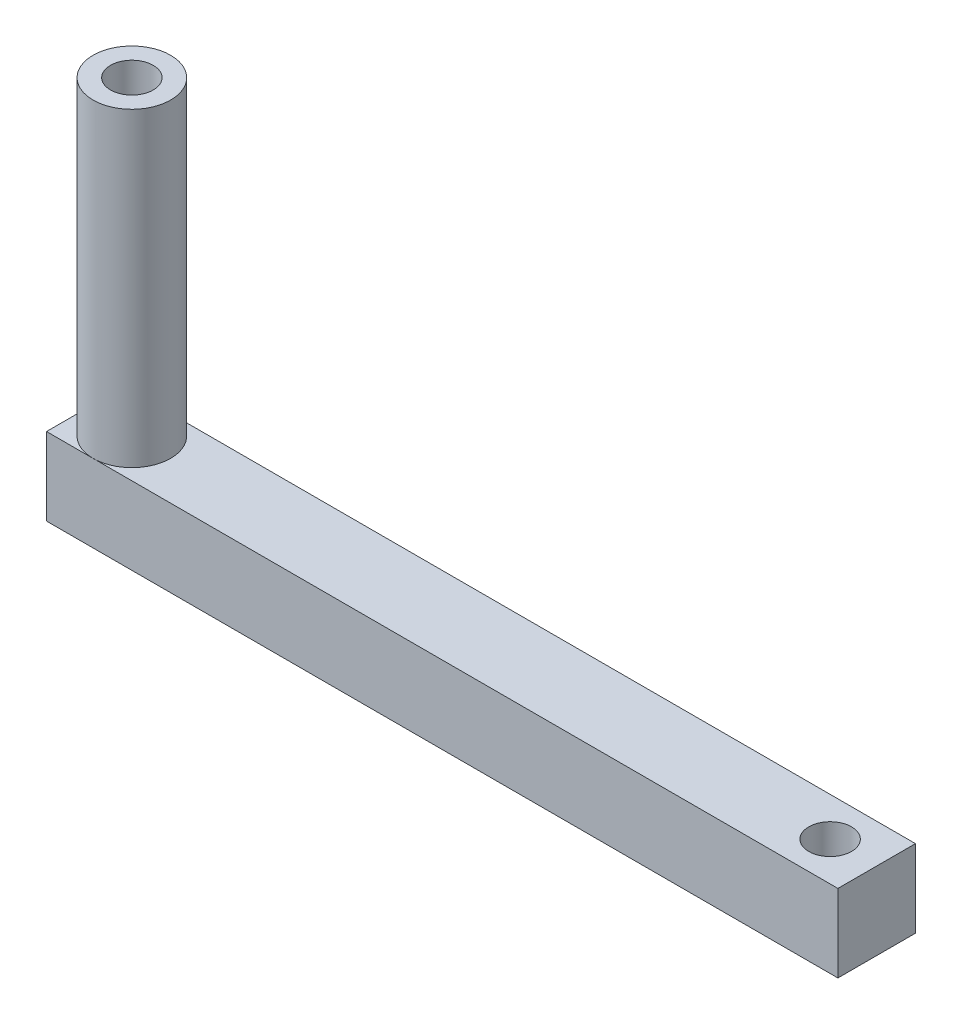
ISO-10303-21;
HEADER;
FILE_DESCRIPTION(('STEP AP214'),'2;1');
FILE_NAME('part.step','',(''),(''),'','','');
FILE_SCHEMA(('AUTOMOTIVE_DESIGN { 1 0 10303 214 1 1 1 1 }'));
ENDSEC;
DATA;
#1=APPLICATION_CONTEXT('core data for automotive mechanical design processes');
#2=APPLICATION_PROTOCOL_DEFINITION('international standard','automotive_design',2000,#1);
#3=PRODUCT_CONTEXT('',#1,'mechanical');
#4=PRODUCT('Part','Part','',(#3));
#5=PRODUCT_RELATED_PRODUCT_CATEGORY('part','',(#4));
#6=PRODUCT_DEFINITION_FORMATION('','',#4);
#7=PRODUCT_DEFINITION_CONTEXT('part definition',#1,'design');
#8=PRODUCT_DEFINITION('design','',#6,#7);
#9=PRODUCT_DEFINITION_SHAPE('','',#8);
#10=(LENGTH_UNIT() NAMED_UNIT(*) SI_UNIT(.MILLI.,.METRE.));
#11=(NAMED_UNIT(*) PLANE_ANGLE_UNIT() SI_UNIT($,.RADIAN.));
#12=(NAMED_UNIT(*) SI_UNIT($,.STERADIAN.) SOLID_ANGLE_UNIT());
#13=UNCERTAINTY_MEASURE_WITH_UNIT(LENGTH_MEASURE(1.E-05),#10,'distance_accuracy_value','');
#14=(GEOMETRIC_REPRESENTATION_CONTEXT(3) GLOBAL_UNCERTAINTY_ASSIGNED_CONTEXT((#13)) GLOBAL_UNIT_ASSIGNED_CONTEXT((#10,
#11,#12)) REPRESENTATION_CONTEXT('',''));
#15=CARTESIAN_POINT('',(0.,0.,0.));
#16=DIRECTION('',(0.,0.,1.));
#17=DIRECTION('',(1.,0.,0.));
#18=AXIS2_PLACEMENT_3D('',#15,#16,#17);
#19=CARTESIAN_POINT('',(0.,0.,0.));
#20=DIRECTION('',(0.,-1.,0.));
#21=DIRECTION('',(0.,0.,-1.));
#22=AXIS2_PLACEMENT_3D('',#19,#20,#21);
#23=PLANE('',#22);
#24=CARTESIAN_POINT('',(60.96,0.,-3.175));
#25=DIRECTION('',(0.,1.,0.));
#26=DIRECTION('',(0.,0.,1.));
#27=AXIS2_PLACEMENT_3D('',#24,#25,#26);
#28=CIRCLE('',#27,1.75);
#29=CARTESIAN_POINT('',(60.96,0.,-1.425));
#30=VERTEX_POINT('',#29);
#31=EDGE_CURVE('E157',#30,#30,#28,.T.);
#32=ORIENTED_EDGE('',*,*,#31,.F.);
#33=EDGE_LOOP('',(#32));
#34=FACE_BOUND('',#33,.T.);
#35=DIRECTION('',(-1.,0.,0.));
#36=VECTOR('',#35,1.);
#37=CARTESIAN_POINT('',(0.,0.,-6.35));
#38=LINE('',#37,#36);
#39=CARTESIAN_POINT('',(64.77,0.,-6.35));
#40=VERTEX_POINT('',#39);
#41=CARTESIAN_POINT('',(3.81,0.,-6.35));
#42=VERTEX_POINT('',#41);
#43=EDGE_CURVE('E109',#40,#42,#38,.T.);
#44=ORIENTED_EDGE('',*,*,#43,.T.);
#45=CARTESIAN_POINT('',(3.81,0.,-3.175));
#46=DIRECTION('',(0.,-1.,0.));
#47=DIRECTION('',(0.,0.,-1.));
#48=AXIS2_PLACEMENT_3D('',#45,#46,#47);
#49=CIRCLE('',#48,3.175);
#50=CARTESIAN_POINT('',(3.81,0.,0.));
#51=VERTEX_POINT('',#50);
#52=EDGE_CURVE('E57',#42,#51,#49,.T.);
#53=ORIENTED_EDGE('',*,*,#52,.T.);
#54=DIRECTION('',(1.,0.,0.));
#55=VECTOR('',#54,1.);
#56=CARTESIAN_POINT('',(0.,0.,0.));
#57=LINE('',#56,#55);
#58=CARTESIAN_POINT('',(64.77,0.,0.));
#59=VERTEX_POINT('',#58);
#60=EDGE_CURVE('E106',#51,#59,#57,.T.);
#61=ORIENTED_EDGE('',*,*,#60,.T.);
#62=DIRECTION('',(0.,0.,-1.));
#63=VECTOR('',#62,1.);
#64=CARTESIAN_POINT('',(64.77,0.,0.));
#65=LINE('',#64,#63);
#66=EDGE_CURVE('E122',#59,#40,#65,.T.);
#67=ORIENTED_EDGE('',*,*,#66,.T.);
#68=EDGE_LOOP('',(#44,#53,#61,#67));
#69=FACE_BOUND('',#68,.T.);
#70=ADVANCED_FACE('F45',(#34,#69),#23,.F.);
#71=CARTESIAN_POINT('',(0.,-6.35,0.));
#72=DIRECTION('',(-1.,0.,0.));
#73=DIRECTION('',(0.,0.,1.));
#74=AXIS2_PLACEMENT_3D('',#71,#72,#73);
#75=PLANE('',#74);
#76=DIRECTION('',(0.,0.,1.));
#77=VECTOR('',#76,1.);
#78=CARTESIAN_POINT('',(0.,0.,0.));
#79=LINE('',#78,#77);
#80=CARTESIAN_POINT('',(0.,0.,-6.35));
#81=VERTEX_POINT('',#80);
#82=CARTESIAN_POINT('',(0.,0.,0.));
#83=VERTEX_POINT('',#82);
#84=EDGE_CURVE('E118',#81,#83,#79,.T.);
#85=ORIENTED_EDGE('',*,*,#84,.F.);
#86=DIRECTION('',(0.,1.,0.));
#87=VECTOR('',#86,1.);
#88=CARTESIAN_POINT('',(0.,-6.35,-6.35));
#89=LINE('',#88,#87);
#90=CARTESIAN_POINT('',(0.,-6.35,-6.35));
#91=VERTEX_POINT('',#90);
#92=EDGE_CURVE('E55',#91,#81,#89,.T.);
#93=ORIENTED_EDGE('',*,*,#92,.F.);
#94=DIRECTION('',(0.,0.,1.));
#95=VECTOR('',#94,1.);
#96=CARTESIAN_POINT('',(0.,-6.35,0.));
#97=LINE('',#96,#95);
#98=CARTESIAN_POINT('',(0.,-6.35,0.));
#99=VERTEX_POINT('',#98);
#100=EDGE_CURVE('E130',#91,#99,#97,.T.);
#101=ORIENTED_EDGE('',*,*,#100,.T.);
#102=DIRECTION('',(0.,1.,0.));
#103=VECTOR('',#102,1.);
#104=CARTESIAN_POINT('',(0.,-6.35,0.));
#105=LINE('',#104,#103);
#106=EDGE_CURVE('E49',#99,#83,#105,.T.);
#107=ORIENTED_EDGE('',*,*,#106,.T.);
#108=EDGE_LOOP('',(#85,#93,#101,#107));
#109=FACE_BOUND('',#108,.T.);
#110=ADVANCED_FACE('F47',(#109),#75,.T.);
#111=CARTESIAN_POINT('',(0.,-6.35,-6.35));
#112=DIRECTION('',(0.,0.,-1.));
#113=DIRECTION('',(-1.,0.,0.));
#114=AXIS2_PLACEMENT_3D('',#111,#112,#113);
#115=PLANE('',#114);
#116=ORIENTED_EDGE('',*,*,#43,.F.);
#117=DIRECTION('',(0.,1.,0.));
#118=VECTOR('',#117,1.);
#119=CARTESIAN_POINT('',(64.77,-6.35,-6.35));
#120=LINE('',#119,#118);
#121=CARTESIAN_POINT('',(64.77,-6.35,-6.35));
#122=VERTEX_POINT('',#121);
#123=EDGE_CURVE('E133',#122,#40,#120,.T.);
#124=ORIENTED_EDGE('',*,*,#123,.F.);
#125=DIRECTION('',(-1.,0.,0.));
#126=VECTOR('',#125,1.);
#127=CARTESIAN_POINT('',(0.,-6.35,-6.35));
#128=LINE('',#127,#126);
#129=EDGE_CURVE('E137',#122,#91,#128,.T.);
#130=ORIENTED_EDGE('',*,*,#129,.T.);
#131=ORIENTED_EDGE('',*,*,#92,.T.);
#132=EDGE_CURVE('E91',#42,#81,#38,.T.);
#133=ORIENTED_EDGE('',*,*,#132,.F.);
#134=EDGE_LOOP('',(#116,#124,#130,#131,#133));
#135=FACE_BOUND('',#134,.T.);
#136=ADVANCED_FACE('F196',(#135),#115,.T.);
#137=CARTESIAN_POINT('',(64.77,-6.35,0.));
#138=DIRECTION('',(1.,0.,0.));
#139=DIRECTION('',(0.,0.,-1.));
#140=AXIS2_PLACEMENT_3D('',#137,#138,#139);
#141=PLANE('',#140);
#142=ORIENTED_EDGE('',*,*,#66,.F.);
#143=DIRECTION('',(0.,1.,0.));
#144=VECTOR('',#143,1.);
#145=CARTESIAN_POINT('',(64.77,-6.35,0.));
#146=LINE('',#145,#144);
#147=CARTESIAN_POINT('',(64.77,-6.35,0.));
#148=VERTEX_POINT('',#147);
#149=EDGE_CURVE('E115',#148,#59,#146,.T.);
#150=ORIENTED_EDGE('',*,*,#149,.F.);
#151=DIRECTION('',(0.,0.,-1.));
#152=VECTOR('',#151,1.);
#153=CARTESIAN_POINT('',(64.77,-6.35,0.));
#154=LINE('',#153,#152);
#155=EDGE_CURVE('E140',#148,#122,#154,.T.);
#156=ORIENTED_EDGE('',*,*,#155,.T.);
#157=ORIENTED_EDGE('',*,*,#123,.T.);
#158=EDGE_LOOP('',(#142,#150,#156,#157));
#159=FACE_BOUND('',#158,.T.);
#160=ADVANCED_FACE('F200',(#159),#141,.T.);
#161=CARTESIAN_POINT('',(0.,-6.35,0.));
#162=DIRECTION('',(0.,0.,1.));
#163=DIRECTION('',(1.,0.,0.));
#164=AXIS2_PLACEMENT_3D('',#161,#162,#163);
#165=PLANE('',#164);
#166=EDGE_CURVE('E114',#83,#51,#57,.T.);
#167=ORIENTED_EDGE('',*,*,#166,.F.);
#168=ORIENTED_EDGE('',*,*,#106,.F.);
#169=DIRECTION('',(1.,0.,0.));
#170=VECTOR('',#169,1.);
#171=CARTESIAN_POINT('',(0.,-6.35,0.));
#172=LINE('',#171,#170);
#173=EDGE_CURVE('E145',#99,#148,#172,.T.);
#174=ORIENTED_EDGE('',*,*,#173,.T.);
#175=ORIENTED_EDGE('',*,*,#149,.T.);
#176=ORIENTED_EDGE('',*,*,#60,.F.);
#177=EDGE_LOOP('',(#167,#168,#174,#175,#176));
#178=FACE_BOUND('',#177,.T.);
#179=ADVANCED_FACE('F113',(#178),#165,.T.);
#180=CARTESIAN_POINT('',(0.,-6.35,0.));
#181=DIRECTION('',(0.,-1.,0.));
#182=DIRECTION('',(0.,0.,-1.));
#183=AXIS2_PLACEMENT_3D('',#180,#181,#182);
#184=PLANE('',#183);
#185=CARTESIAN_POINT('',(60.96,-6.35,-3.175));
#186=DIRECTION('',(0.,1.,0.));
#187=DIRECTION('',(0.,0.,1.));
#188=AXIS2_PLACEMENT_3D('',#185,#186,#187);
#189=CIRCLE('',#188,1.75);
#190=CARTESIAN_POINT('',(60.96,-6.35,-1.425));
#191=VERTEX_POINT('',#190);
#192=EDGE_CURVE('E156',#191,#191,#189,.T.);
#193=ORIENTED_EDGE('',*,*,#192,.T.);
#194=EDGE_LOOP('',(#193));
#195=FACE_BOUND('',#194,.T.);
#196=CARTESIAN_POINT('',(3.81,-6.35,-3.175));
#197=DIRECTION('',(0.,1.,0.));
#198=DIRECTION('',(0.,0.,1.));
#199=AXIS2_PLACEMENT_3D('',#196,#197,#198);
#200=CIRCLE('',#199,1.75);
#201=CARTESIAN_POINT('',(3.81,-6.35,-1.425));
#202=VERTEX_POINT('',#201);
#203=EDGE_CURVE('E152',#202,#202,#200,.T.);
#204=ORIENTED_EDGE('',*,*,#203,.T.);
#205=EDGE_LOOP('',(#204));
#206=FACE_BOUND('',#205,.T.);
#207=ORIENTED_EDGE('',*,*,#100,.F.);
#208=ORIENTED_EDGE('',*,*,#129,.F.);
#209=ORIENTED_EDGE('',*,*,#155,.F.);
#210=ORIENTED_EDGE('',*,*,#173,.F.);
#211=EDGE_LOOP('',(#207,#208,#209,#210));
#212=FACE_BOUND('',#211,.T.);
#213=ADVANCED_FACE('F186',(#195,#206,#212),#184,.T.);
#214=ORIENTED_EDGE('',*,*,#166,.T.);
#215=EDGE_CURVE('E11',#51,#42,#49,.T.);
#216=ORIENTED_EDGE('',*,*,#215,.T.);
#217=ORIENTED_EDGE('',*,*,#132,.T.);
#218=ORIENTED_EDGE('',*,*,#84,.T.);
#219=EDGE_LOOP('',(#214,#216,#217,#218));
#220=FACE_BOUND('',#219,.T.);
#221=ADVANCED_FACE('F120',(#220),#23,.F.);
#222=CARTESIAN_POINT('',(3.81,-6.35,-3.175));
#223=DIRECTION('',(0.,1.,0.));
#224=DIRECTION('',(0.,0.,1.));
#225=AXIS2_PLACEMENT_3D('',#222,#223,#224);
#226=CYLINDRICAL_SURFACE('',#225,1.75);
#227=ORIENTED_EDGE('',*,*,#203,.F.);
#228=EDGE_LOOP('',(#227));
#229=FACE_BOUND('',#228,.T.);
#230=CARTESIAN_POINT('',(3.81,25.4,-3.175));
#231=DIRECTION('',(0.,-1.,0.));
#232=DIRECTION('',(0.,0.,-1.));
#233=AXIS2_PLACEMENT_3D('',#230,#231,#232);
#234=CIRCLE('',#233,1.75);
#235=CARTESIAN_POINT('',(3.81,25.4,-4.925));
#236=VERTEX_POINT('',#235);
#237=EDGE_CURVE('E112',#236,#236,#234,.T.);
#238=ORIENTED_EDGE('',*,*,#237,.F.);
#239=EDGE_LOOP('',(#238));
#240=FACE_BOUND('',#239,.T.);
#241=ADVANCED_FACE('F174',(#229,#240),#226,.F.);
#242=CARTESIAN_POINT('',(60.96,-6.35,-3.175));
#243=DIRECTION('',(0.,1.,0.));
#244=DIRECTION('',(0.,0.,1.));
#245=AXIS2_PLACEMENT_3D('',#242,#243,#244);
#246=CYLINDRICAL_SURFACE('',#245,1.75);
#247=ORIENTED_EDGE('',*,*,#192,.F.);
#248=EDGE_LOOP('',(#247));
#249=FACE_BOUND('',#248,.T.);
#250=ORIENTED_EDGE('',*,*,#31,.T.);
#251=EDGE_LOOP('',(#250));
#252=FACE_BOUND('',#251,.T.);
#253=ADVANCED_FACE('F176',(#249,#252),#246,.F.);
#254=CARTESIAN_POINT('',(3.81,25.4,-3.175));
#255=DIRECTION('',(0.,-1.,0.));
#256=DIRECTION('',(0.,0.,-1.));
#257=AXIS2_PLACEMENT_3D('',#254,#255,#256);
#258=CYLINDRICAL_SURFACE('',#257,3.175);
#259=CARTESIAN_POINT('',(3.81,25.4,-3.175));
#260=DIRECTION('',(0.,-1.,0.));
#261=DIRECTION('',(0.,0.,-1.));
#262=AXIS2_PLACEMENT_3D('',#259,#260,#261);
#263=CIRCLE('',#262,3.175);
#264=CARTESIAN_POINT('',(3.81,25.4,-6.35));
#265=VERTEX_POINT('',#264);
#266=EDGE_CURVE('E111',#265,#265,#263,.T.);
#267=ORIENTED_EDGE('',*,*,#266,.T.);
#268=EDGE_LOOP('',(#267));
#269=FACE_BOUND('',#268,.T.);
#270=ORIENTED_EDGE('',*,*,#52,.F.);
#271=ORIENTED_EDGE('',*,*,#215,.F.);
#272=EDGE_LOOP('',(#270,#271));
#273=FACE_BOUND('',#272,.T.);
#274=ADVANCED_FACE('F100',(#269,#273),#258,.T.);
#275=CARTESIAN_POINT('',(3.81,25.4,-3.175));
#276=DIRECTION('',(0.,-1.,0.));
#277=DIRECTION('',(0.,0.,-1.));
#278=AXIS2_PLACEMENT_3D('',#275,#276,#277);
#279=PLANE('',#278);
#280=ORIENTED_EDGE('',*,*,#237,.T.);
#281=EDGE_LOOP('',(#280));
#282=FACE_BOUND('',#281,.T.);
#283=ORIENTED_EDGE('',*,*,#266,.F.);
#284=EDGE_LOOP('',(#283));
#285=FACE_BOUND('',#284,.T.);
#286=ADVANCED_FACE('F171',(#282,#285),#279,.F.);
#287=CLOSED_SHELL('',(#70,#110,#136,#160,#179,#213,#221,#241,#253,#274,#286));
#288=MANIFOLD_SOLID_BREP('B2',#287);
#289=ADVANCED_BREP_SHAPE_REPRESENTATION('',(#18,#288),#14);
#290=SHAPE_DEFINITION_REPRESENTATION(#9,#289);
ENDSEC;
END-ISO-10303-21;
